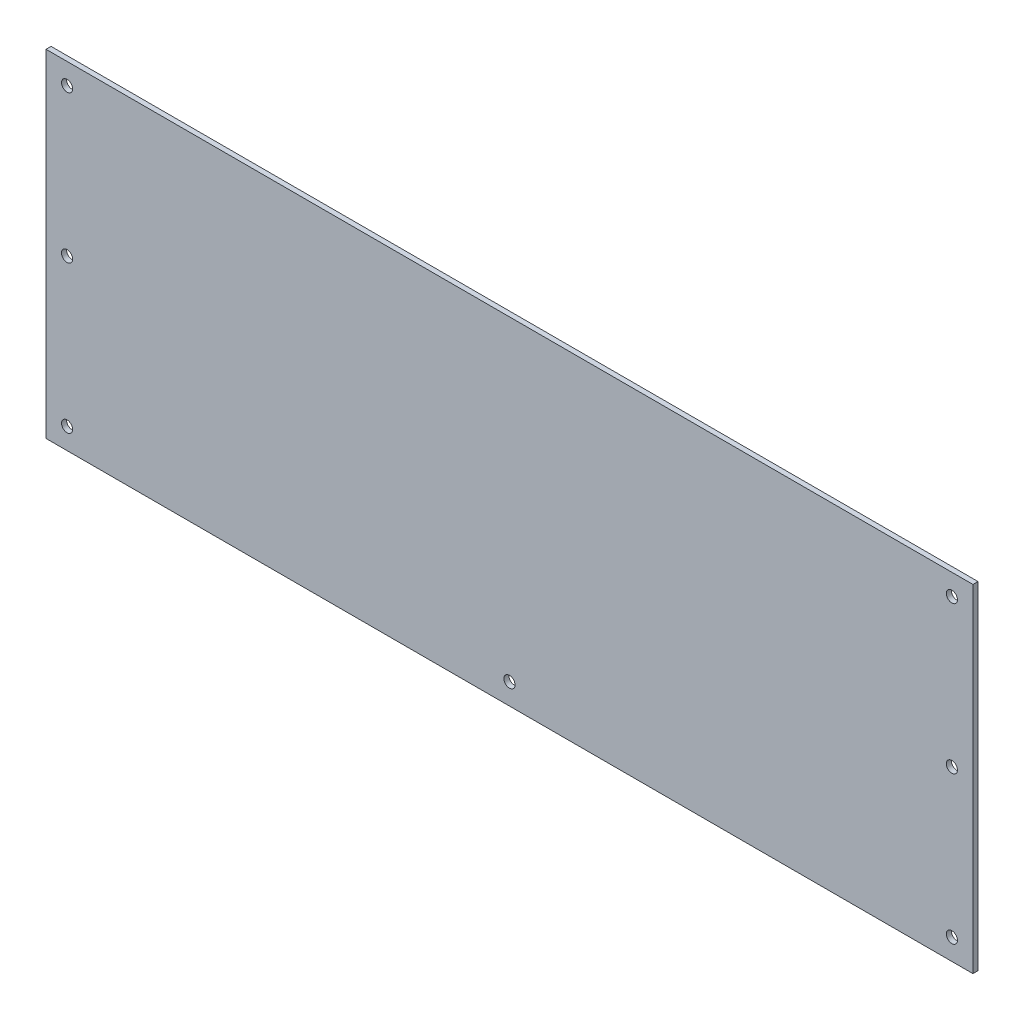
ISO-10303-21;
HEADER;
FILE_DESCRIPTION(('STEP AP214'),'2;1');
FILE_NAME('part.step','',(''),(''),'','','');
FILE_SCHEMA(('AUTOMOTIVE_DESIGN { 1 0 10303 214 1 1 1 1 }'));
ENDSEC;
DATA;
#1=APPLICATION_CONTEXT('core data for automotive mechanical design processes');
#2=APPLICATION_PROTOCOL_DEFINITION('international standard','automotive_design',2000,#1);
#3=PRODUCT_CONTEXT('',#1,'mechanical');
#4=PRODUCT('Part','Part','',(#3));
#5=PRODUCT_RELATED_PRODUCT_CATEGORY('part','',(#4));
#6=PRODUCT_DEFINITION_FORMATION('','',#4);
#7=PRODUCT_DEFINITION_CONTEXT('part definition',#1,'design');
#8=PRODUCT_DEFINITION('design','',#6,#7);
#9=PRODUCT_DEFINITION_SHAPE('','',#8);
#10=(LENGTH_UNIT() NAMED_UNIT(*) SI_UNIT(.MILLI.,.METRE.));
#11=(NAMED_UNIT(*) PLANE_ANGLE_UNIT() SI_UNIT($,.RADIAN.));
#12=(NAMED_UNIT(*) SI_UNIT($,.STERADIAN.) SOLID_ANGLE_UNIT());
#13=UNCERTAINTY_MEASURE_WITH_UNIT(LENGTH_MEASURE(1.E-05),#10,'distance_accuracy_value','');
#14=(GEOMETRIC_REPRESENTATION_CONTEXT(3) GLOBAL_UNCERTAINTY_ASSIGNED_CONTEXT((#13)) GLOBAL_UNIT_ASSIGNED_CONTEXT((#10,
#11,#12)) REPRESENTATION_CONTEXT('',''));
#15=CARTESIAN_POINT('',(0.,0.,0.));
#16=DIRECTION('',(0.,0.,1.));
#17=DIRECTION('',(1.,0.,0.));
#18=AXIS2_PLACEMENT_3D('',#15,#16,#17);
#19=CARTESIAN_POINT('',(0.,0.,3.));
#20=DIRECTION('',(1.,0.,0.));
#21=DIRECTION('',(0.,0.,-1.));
#22=AXIS2_PLACEMENT_3D('',#19,#20,#21);
#23=PLANE('',#22);
#24=DIRECTION('',(0.,-1.,0.));
#25=VECTOR('',#24,1.);
#26=CARTESIAN_POINT('',(0.,0.,0.));
#27=LINE('',#26,#25);
#28=CARTESIAN_POINT('',(0.,200.,0.));
#29=VERTEX_POINT('',#28);
#30=CARTESIAN_POINT('',(0.,0.,0.));
#31=VERTEX_POINT('',#30);
#32=EDGE_CURVE('E95',#29,#31,#27,.T.);
#33=ORIENTED_EDGE('',*,*,#32,.T.);
#34=DIRECTION('',(0.,0.,-1.));
#35=VECTOR('',#34,1.);
#36=CARTESIAN_POINT('',(0.,0.,3.));
#37=LINE('',#36,#35);
#38=CARTESIAN_POINT('',(0.,0.,3.));
#39=VERTEX_POINT('',#38);
#40=EDGE_CURVE('E11',#39,#31,#37,.T.);
#41=ORIENTED_EDGE('',*,*,#40,.F.);
#42=DIRECTION('',(0.,-1.,0.));
#43=VECTOR('',#42,1.);
#44=CARTESIAN_POINT('',(0.,0.,3.));
#45=LINE('',#44,#43);
#46=CARTESIAN_POINT('',(0.,200.,3.));
#47=VERTEX_POINT('',#46);
#48=EDGE_CURVE('E83',#47,#39,#45,.T.);
#49=ORIENTED_EDGE('',*,*,#48,.F.);
#50=DIRECTION('',(0.,0.,-1.));
#51=VECTOR('',#50,1.);
#52=CARTESIAN_POINT('',(0.,200.,3.));
#53=LINE('',#52,#51);
#54=EDGE_CURVE('E91',#47,#29,#53,.T.);
#55=ORIENTED_EDGE('',*,*,#54,.T.);
#56=EDGE_LOOP('',(#33,#41,#49,#55));
#57=FACE_BOUND('',#56,.T.);
#58=ADVANCED_FACE('F32',(#57),#23,.F.);
#59=CARTESIAN_POINT('',(0.,0.,3.));
#60=DIRECTION('',(0.,1.,0.));
#61=DIRECTION('',(0.,0.,1.));
#62=AXIS2_PLACEMENT_3D('',#59,#60,#61);
#63=PLANE('',#62);
#64=DIRECTION('',(1.,0.,0.));
#65=VECTOR('',#64,1.);
#66=CARTESIAN_POINT('',(0.,0.,0.));
#67=LINE('',#66,#65);
#68=CARTESIAN_POINT('',(550.,0.,0.));
#69=VERTEX_POINT('',#68);
#70=EDGE_CURVE('E87',#31,#69,#67,.T.);
#71=ORIENTED_EDGE('',*,*,#70,.T.);
#72=DIRECTION('',(0.,0.,-1.));
#73=VECTOR('',#72,1.);
#74=CARTESIAN_POINT('',(550.,0.,3.));
#75=LINE('',#74,#73);
#76=CARTESIAN_POINT('',(550.,0.,3.));
#77=VERTEX_POINT('',#76);
#78=EDGE_CURVE('E40',#77,#69,#75,.T.);
#79=ORIENTED_EDGE('',*,*,#78,.F.);
#80=DIRECTION('',(1.,0.,0.));
#81=VECTOR('',#80,1.);
#82=CARTESIAN_POINT('',(0.,0.,3.));
#83=LINE('',#82,#81);
#84=EDGE_CURVE('E78',#39,#77,#83,.T.);
#85=ORIENTED_EDGE('',*,*,#84,.F.);
#86=ORIENTED_EDGE('',*,*,#40,.T.);
#87=EDGE_LOOP('',(#71,#79,#85,#86));
#88=FACE_BOUND('',#87,.T.);
#89=ADVANCED_FACE('F86',(#88),#63,.F.);
#90=CARTESIAN_POINT('',(550.,0.,3.));
#91=DIRECTION('',(-1.,0.,0.));
#92=DIRECTION('',(0.,0.,1.));
#93=AXIS2_PLACEMENT_3D('',#90,#91,#92);
#94=PLANE('',#93);
#95=DIRECTION('',(0.,1.,0.));
#96=VECTOR('',#95,1.);
#97=CARTESIAN_POINT('',(550.,0.,0.));
#98=LINE('',#97,#96);
#99=CARTESIAN_POINT('',(550.,200.,0.));
#100=VERTEX_POINT('',#99);
#101=EDGE_CURVE('E65',#69,#100,#98,.T.);
#102=ORIENTED_EDGE('',*,*,#101,.T.);
#103=DIRECTION('',(0.,0.,-1.));
#104=VECTOR('',#103,1.);
#105=CARTESIAN_POINT('',(550.,200.,3.));
#106=LINE('',#105,#104);
#107=CARTESIAN_POINT('',(550.,200.,3.));
#108=VERTEX_POINT('',#107);
#109=EDGE_CURVE('E88',#108,#100,#106,.T.);
#110=ORIENTED_EDGE('',*,*,#109,.F.);
#111=DIRECTION('',(0.,1.,0.));
#112=VECTOR('',#111,1.);
#113=CARTESIAN_POINT('',(550.,0.,3.));
#114=LINE('',#113,#112);
#115=EDGE_CURVE('E81',#77,#108,#114,.T.);
#116=ORIENTED_EDGE('',*,*,#115,.F.);
#117=ORIENTED_EDGE('',*,*,#78,.T.);
#118=EDGE_LOOP('',(#102,#110,#116,#117));
#119=FACE_BOUND('',#118,.T.);
#120=ADVANCED_FACE('F89',(#119),#94,.F.);
#121=CARTESIAN_POINT('',(0.,200.,3.));
#122=DIRECTION('',(0.,-1.,0.));
#123=DIRECTION('',(0.,0.,-1.));
#124=AXIS2_PLACEMENT_3D('',#121,#122,#123);
#125=PLANE('',#124);
#126=DIRECTION('',(-1.,0.,0.));
#127=VECTOR('',#126,1.);
#128=CARTESIAN_POINT('',(0.,200.,0.));
#129=LINE('',#128,#127);
#130=EDGE_CURVE('E71',#100,#29,#129,.T.);
#131=ORIENTED_EDGE('',*,*,#130,.T.);
#132=ORIENTED_EDGE('',*,*,#54,.F.);
#133=DIRECTION('',(-1.,0.,0.));
#134=VECTOR('',#133,1.);
#135=CARTESIAN_POINT('',(0.,200.,3.));
#136=LINE('',#135,#134);
#137=EDGE_CURVE('E48',#108,#47,#136,.T.);
#138=ORIENTED_EDGE('',*,*,#137,.F.);
#139=ORIENTED_EDGE('',*,*,#109,.T.);
#140=EDGE_LOOP('',(#131,#132,#138,#139));
#141=FACE_BOUND('',#140,.T.);
#142=ADVANCED_FACE('F103',(#141),#125,.F.);
#143=CARTESIAN_POINT('',(0.,0.,3.));
#144=DIRECTION('',(0.,0.,-1.));
#145=DIRECTION('',(-1.,0.,0.));
#146=AXIS2_PLACEMENT_3D('',#143,#144,#145);
#147=PLANE('',#146);
#148=CARTESIAN_POINT('',(12.5,100.,3.));
#149=DIRECTION('',(0.,0.,1.));
#150=DIRECTION('',(1.,0.,0.));
#151=AXIS2_PLACEMENT_3D('',#148,#149,#150);
#152=CIRCLE('',#151,3.3);
#153=CARTESIAN_POINT('',(15.8,100.,3.));
#154=VERTEX_POINT('',#153);
#155=EDGE_CURVE('E147',#154,#154,#152,.T.);
#156=ORIENTED_EDGE('',*,*,#155,.F.);
#157=EDGE_LOOP('',(#156));
#158=FACE_BOUND('',#157,.T.);
#159=CARTESIAN_POINT('',(12.5,187.5,3.));
#160=DIRECTION('',(0.,0.,1.));
#161=DIRECTION('',(1.,0.,0.));
#162=AXIS2_PLACEMENT_3D('',#159,#160,#161);
#163=CIRCLE('',#162,3.3);
#164=CARTESIAN_POINT('',(15.8,187.5,3.));
#165=VERTEX_POINT('',#164);
#166=EDGE_CURVE('E141',#165,#165,#163,.T.);
#167=ORIENTED_EDGE('',*,*,#166,.F.);
#168=EDGE_LOOP('',(#167));
#169=FACE_BOUND('',#168,.T.);
#170=CARTESIAN_POINT('',(12.5,12.5,3.));
#171=DIRECTION('',(0.,0.,1.));
#172=DIRECTION('',(1.,0.,0.));
#173=AXIS2_PLACEMENT_3D('',#170,#171,#172);
#174=CIRCLE('',#173,3.3);
#175=CARTESIAN_POINT('',(15.8,12.5,3.));
#176=VERTEX_POINT('',#175);
#177=EDGE_CURVE('E135',#176,#176,#174,.T.);
#178=ORIENTED_EDGE('',*,*,#177,.F.);
#179=EDGE_LOOP('',(#178));
#180=FACE_BOUND('',#179,.T.);
#181=CARTESIAN_POINT('',(275.,12.5,3.));
#182=DIRECTION('',(0.,0.,1.));
#183=DIRECTION('',(1.,0.,0.));
#184=AXIS2_PLACEMENT_3D('',#181,#182,#183);
#185=CIRCLE('',#184,3.30000000000003);
#186=CARTESIAN_POINT('',(278.3,12.5,3.));
#187=VERTEX_POINT('',#186);
#188=EDGE_CURVE('E129',#187,#187,#185,.T.);
#189=ORIENTED_EDGE('',*,*,#188,.F.);
#190=EDGE_LOOP('',(#189));
#191=FACE_BOUND('',#190,.T.);
#192=CARTESIAN_POINT('',(537.5,12.5,3.));
#193=DIRECTION('',(0.,0.,1.));
#194=DIRECTION('',(1.,0.,0.));
#195=AXIS2_PLACEMENT_3D('',#192,#193,#194);
#196=CIRCLE('',#195,3.29999999999997);
#197=CARTESIAN_POINT('',(540.8,12.5,3.));
#198=VERTEX_POINT('',#197);
#199=EDGE_CURVE('E123',#198,#198,#196,.T.);
#200=ORIENTED_EDGE('',*,*,#199,.F.);
#201=EDGE_LOOP('',(#200));
#202=FACE_BOUND('',#201,.T.);
#203=CARTESIAN_POINT('',(537.5,100.,3.));
#204=DIRECTION('',(0.,0.,1.));
#205=DIRECTION('',(1.,0.,0.));
#206=AXIS2_PLACEMENT_3D('',#203,#204,#205);
#207=CIRCLE('',#206,3.29999999999997);
#208=CARTESIAN_POINT('',(540.8,100.,3.));
#209=VERTEX_POINT('',#208);
#210=EDGE_CURVE('E117',#209,#209,#207,.T.);
#211=ORIENTED_EDGE('',*,*,#210,.F.);
#212=EDGE_LOOP('',(#211));
#213=FACE_BOUND('',#212,.T.);
#214=CARTESIAN_POINT('',(537.5,187.5,3.));
#215=DIRECTION('',(0.,0.,1.));
#216=DIRECTION('',(1.,0.,0.));
#217=AXIS2_PLACEMENT_3D('',#214,#215,#216);
#218=CIRCLE('',#217,3.29999999999997);
#219=CARTESIAN_POINT('',(540.8,187.5,3.));
#220=VERTEX_POINT('',#219);
#221=EDGE_CURVE('E111',#220,#220,#218,.T.);
#222=ORIENTED_EDGE('',*,*,#221,.F.);
#223=EDGE_LOOP('',(#222));
#224=FACE_BOUND('',#223,.T.);
#225=ORIENTED_EDGE('',*,*,#48,.T.);
#226=ORIENTED_EDGE('',*,*,#84,.T.);
#227=ORIENTED_EDGE('',*,*,#115,.T.);
#228=ORIENTED_EDGE('',*,*,#137,.T.);
#229=EDGE_LOOP('',(#225,#226,#227,#228));
#230=FACE_BOUND('',#229,.T.);
#231=ADVANCED_FACE('F79',(#158,#169,#180,#191,#202,#213,#224,#230),#147,.F.);
#232=CARTESIAN_POINT('',(0.,0.,0.));
#233=DIRECTION('',(0.,0.,-1.));
#234=DIRECTION('',(-1.,0.,0.));
#235=AXIS2_PLACEMENT_3D('',#232,#233,#234);
#236=PLANE('',#235);
#237=CARTESIAN_POINT('',(12.5,100.,0.));
#238=DIRECTION('',(0.,0.,1.));
#239=DIRECTION('',(1.,0.,0.));
#240=AXIS2_PLACEMENT_3D('',#237,#238,#239);
#241=CIRCLE('',#240,3.3);
#242=CARTESIAN_POINT('',(15.8,100.,0.));
#243=VERTEX_POINT('',#242);
#244=EDGE_CURVE('E144',#243,#243,#241,.T.);
#245=ORIENTED_EDGE('',*,*,#244,.T.);
#246=EDGE_LOOP('',(#245));
#247=FACE_BOUND('',#246,.T.);
#248=CARTESIAN_POINT('',(12.5,187.5,0.));
#249=DIRECTION('',(0.,0.,1.));
#250=DIRECTION('',(1.,0.,0.));
#251=AXIS2_PLACEMENT_3D('',#248,#249,#250);
#252=CIRCLE('',#251,3.3);
#253=CARTESIAN_POINT('',(15.8,187.5,0.));
#254=VERTEX_POINT('',#253);
#255=EDGE_CURVE('E138',#254,#254,#252,.T.);
#256=ORIENTED_EDGE('',*,*,#255,.T.);
#257=EDGE_LOOP('',(#256));
#258=FACE_BOUND('',#257,.T.);
#259=CARTESIAN_POINT('',(12.5,12.5,0.));
#260=DIRECTION('',(0.,0.,1.));
#261=DIRECTION('',(1.,0.,0.));
#262=AXIS2_PLACEMENT_3D('',#259,#260,#261);
#263=CIRCLE('',#262,3.3);
#264=CARTESIAN_POINT('',(15.8,12.5,0.));
#265=VERTEX_POINT('',#264);
#266=EDGE_CURVE('E132',#265,#265,#263,.T.);
#267=ORIENTED_EDGE('',*,*,#266,.T.);
#268=EDGE_LOOP('',(#267));
#269=FACE_BOUND('',#268,.T.);
#270=CARTESIAN_POINT('',(275.,12.5,0.));
#271=DIRECTION('',(0.,0.,1.));
#272=DIRECTION('',(1.,0.,0.));
#273=AXIS2_PLACEMENT_3D('',#270,#271,#272);
#274=CIRCLE('',#273,3.30000000000003);
#275=CARTESIAN_POINT('',(278.3,12.5,0.));
#276=VERTEX_POINT('',#275);
#277=EDGE_CURVE('E126',#276,#276,#274,.T.);
#278=ORIENTED_EDGE('',*,*,#277,.T.);
#279=EDGE_LOOP('',(#278));
#280=FACE_BOUND('',#279,.T.);
#281=CARTESIAN_POINT('',(537.5,12.5,0.));
#282=DIRECTION('',(0.,0.,1.));
#283=DIRECTION('',(1.,0.,0.));
#284=AXIS2_PLACEMENT_3D('',#281,#282,#283);
#285=CIRCLE('',#284,3.29999999999997);
#286=CARTESIAN_POINT('',(540.8,12.5,0.));
#287=VERTEX_POINT('',#286);
#288=EDGE_CURVE('E120',#287,#287,#285,.T.);
#289=ORIENTED_EDGE('',*,*,#288,.T.);
#290=EDGE_LOOP('',(#289));
#291=FACE_BOUND('',#290,.T.);
#292=CARTESIAN_POINT('',(537.5,100.,0.));
#293=DIRECTION('',(0.,0.,1.));
#294=DIRECTION('',(1.,0.,0.));
#295=AXIS2_PLACEMENT_3D('',#292,#293,#294);
#296=CIRCLE('',#295,3.29999999999997);
#297=CARTESIAN_POINT('',(540.8,100.,0.));
#298=VERTEX_POINT('',#297);
#299=EDGE_CURVE('E114',#298,#298,#296,.T.);
#300=ORIENTED_EDGE('',*,*,#299,.T.);
#301=EDGE_LOOP('',(#300));
#302=FACE_BOUND('',#301,.T.);
#303=CARTESIAN_POINT('',(537.5,187.5,0.));
#304=DIRECTION('',(0.,0.,1.));
#305=DIRECTION('',(1.,0.,0.));
#306=AXIS2_PLACEMENT_3D('',#303,#304,#305);
#307=CIRCLE('',#306,3.29999999999997);
#308=CARTESIAN_POINT('',(540.8,187.5,0.));
#309=VERTEX_POINT('',#308);
#310=EDGE_CURVE('E98',#309,#309,#307,.T.);
#311=ORIENTED_EDGE('',*,*,#310,.T.);
#312=EDGE_LOOP('',(#311));
#313=FACE_BOUND('',#312,.T.);
#314=ORIENTED_EDGE('',*,*,#32,.F.);
#315=ORIENTED_EDGE('',*,*,#130,.F.);
#316=ORIENTED_EDGE('',*,*,#101,.F.);
#317=ORIENTED_EDGE('',*,*,#70,.F.);
#318=EDGE_LOOP('',(#314,#315,#316,#317));
#319=FACE_BOUND('',#318,.T.);
#320=ADVANCED_FACE('F106',(#247,#258,#269,#280,#291,#302,#313,#319),#236,.T.);
#321=CARTESIAN_POINT('',(537.5,187.5,3.));
#322=DIRECTION('',(0.,0.,1.));
#323=DIRECTION('',(1.,0.,0.));
#324=AXIS2_PLACEMENT_3D('',#321,#322,#323);
#325=CYLINDRICAL_SURFACE('',#324,3.29999999999997);
#326=ORIENTED_EDGE('',*,*,#310,.F.);
#327=EDGE_LOOP('',(#326));
#328=FACE_BOUND('',#327,.T.);
#329=ORIENTED_EDGE('',*,*,#221,.T.);
#330=EDGE_LOOP('',(#329));
#331=FACE_BOUND('',#330,.T.);
#332=ADVANCED_FACE('F168',(#328,#331),#325,.F.);
#333=CARTESIAN_POINT('',(537.5,100.,3.));
#334=DIRECTION('',(0.,0.,1.));
#335=DIRECTION('',(1.,0.,0.));
#336=AXIS2_PLACEMENT_3D('',#333,#334,#335);
#337=CYLINDRICAL_SURFACE('',#336,3.29999999999997);
#338=ORIENTED_EDGE('',*,*,#299,.F.);
#339=EDGE_LOOP('',(#338));
#340=FACE_BOUND('',#339,.T.);
#341=ORIENTED_EDGE('',*,*,#210,.T.);
#342=EDGE_LOOP('',(#341));
#343=FACE_BOUND('',#342,.T.);
#344=ADVANCED_FACE('F170',(#340,#343),#337,.F.);
#345=CARTESIAN_POINT('',(537.5,12.5,3.));
#346=DIRECTION('',(0.,0.,1.));
#347=DIRECTION('',(1.,0.,0.));
#348=AXIS2_PLACEMENT_3D('',#345,#346,#347);
#349=CYLINDRICAL_SURFACE('',#348,3.29999999999997);
#350=ORIENTED_EDGE('',*,*,#288,.F.);
#351=EDGE_LOOP('',(#350));
#352=FACE_BOUND('',#351,.T.);
#353=ORIENTED_EDGE('',*,*,#199,.T.);
#354=EDGE_LOOP('',(#353));
#355=FACE_BOUND('',#354,.T.);
#356=ADVANCED_FACE('F177',(#352,#355),#349,.F.);
#357=CARTESIAN_POINT('',(275.,12.5,3.));
#358=DIRECTION('',(0.,0.,1.));
#359=DIRECTION('',(1.,0.,0.));
#360=AXIS2_PLACEMENT_3D('',#357,#358,#359);
#361=CYLINDRICAL_SURFACE('',#360,3.30000000000003);
#362=ORIENTED_EDGE('',*,*,#277,.F.);
#363=EDGE_LOOP('',(#362));
#364=FACE_BOUND('',#363,.T.);
#365=ORIENTED_EDGE('',*,*,#188,.T.);
#366=EDGE_LOOP('',(#365));
#367=FACE_BOUND('',#366,.T.);
#368=ADVANCED_FACE('F224',(#364,#367),#361,.F.);
#369=CARTESIAN_POINT('',(12.5,12.5,3.));
#370=DIRECTION('',(0.,0.,1.));
#371=DIRECTION('',(1.,0.,0.));
#372=AXIS2_PLACEMENT_3D('',#369,#370,#371);
#373=CYLINDRICAL_SURFACE('',#372,3.3);
#374=ORIENTED_EDGE('',*,*,#266,.F.);
#375=EDGE_LOOP('',(#374));
#376=FACE_BOUND('',#375,.T.);
#377=ORIENTED_EDGE('',*,*,#177,.T.);
#378=EDGE_LOOP('',(#377));
#379=FACE_BOUND('',#378,.T.);
#380=ADVANCED_FACE('F234',(#376,#379),#373,.F.);
#381=CARTESIAN_POINT('',(12.5,187.5,3.));
#382=DIRECTION('',(0.,0.,1.));
#383=DIRECTION('',(1.,0.,0.));
#384=AXIS2_PLACEMENT_3D('',#381,#382,#383);
#385=CYLINDRICAL_SURFACE('',#384,3.3);
#386=ORIENTED_EDGE('',*,*,#255,.F.);
#387=EDGE_LOOP('',(#386));
#388=FACE_BOUND('',#387,.T.);
#389=ORIENTED_EDGE('',*,*,#166,.T.);
#390=EDGE_LOOP('',(#389));
#391=FACE_BOUND('',#390,.T.);
#392=ADVANCED_FACE('F244',(#388,#391),#385,.F.);
#393=CARTESIAN_POINT('',(12.5,100.,3.));
#394=DIRECTION('',(0.,0.,1.));
#395=DIRECTION('',(1.,0.,0.));
#396=AXIS2_PLACEMENT_3D('',#393,#394,#395);
#397=CYLINDRICAL_SURFACE('',#396,3.3);
#398=ORIENTED_EDGE('',*,*,#244,.F.);
#399=EDGE_LOOP('',(#398));
#400=FACE_BOUND('',#399,.T.);
#401=ORIENTED_EDGE('',*,*,#155,.T.);
#402=EDGE_LOOP('',(#401));
#403=FACE_BOUND('',#402,.T.);
#404=ADVANCED_FACE('F151',(#400,#403),#397,.F.);
#405=CLOSED_SHELL('',(#58,#89,#120,#142,#231,#320,#332,#344,#356,#368,#380,#392,#404));
#406=MANIFOLD_SOLID_BREP('B2',#405);
#407=ADVANCED_BREP_SHAPE_REPRESENTATION('',(#18,#406),#14);
#408=SHAPE_DEFINITION_REPRESENTATION(#9,#407);
ENDSEC;
END-ISO-10303-21;
